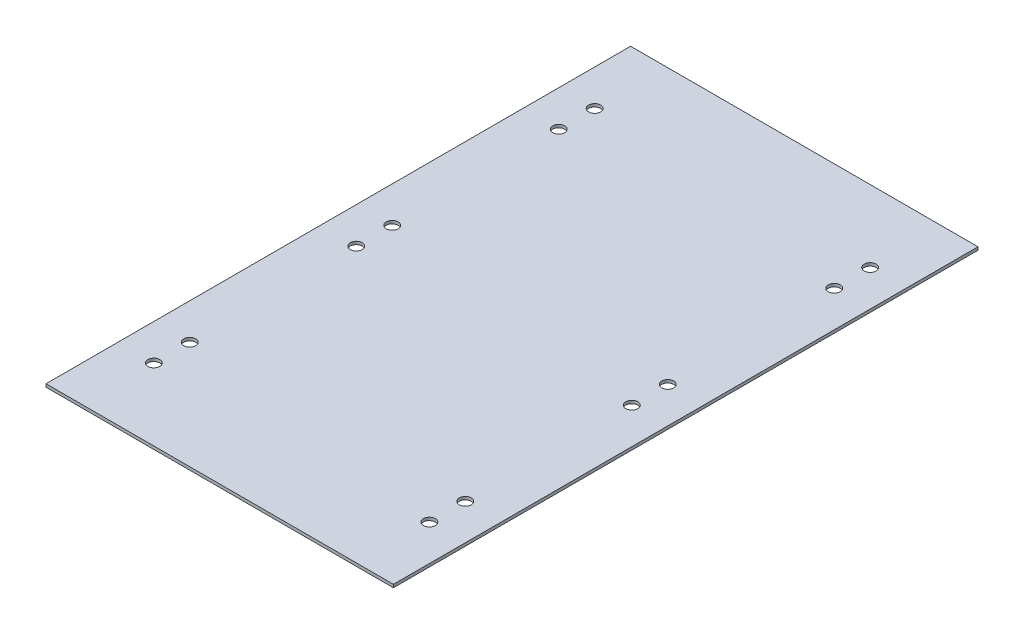
ISO-10303-21;
HEADER;
FILE_DESCRIPTION(('STEP AP214'),'2;1');
FILE_NAME('part.step','',(''),(''),'','','');
FILE_SCHEMA(('AUTOMOTIVE_DESIGN { 1 0 10303 214 1 1 1 1 }'));
ENDSEC;
DATA;
#1=APPLICATION_CONTEXT('core data for automotive mechanical design processes');
#2=APPLICATION_PROTOCOL_DEFINITION('international standard','automotive_design',2000,#1);
#3=PRODUCT_CONTEXT('',#1,'mechanical');
#4=PRODUCT('Part','Part','',(#3));
#5=PRODUCT_RELATED_PRODUCT_CATEGORY('part','',(#4));
#6=PRODUCT_DEFINITION_FORMATION('','',#4);
#7=PRODUCT_DEFINITION_CONTEXT('part definition',#1,'design');
#8=PRODUCT_DEFINITION('design','',#6,#7);
#9=PRODUCT_DEFINITION_SHAPE('','',#8);
#10=(LENGTH_UNIT() NAMED_UNIT(*) SI_UNIT(.MILLI.,.METRE.));
#11=(NAMED_UNIT(*) PLANE_ANGLE_UNIT() SI_UNIT($,.RADIAN.));
#12=(NAMED_UNIT(*) SI_UNIT($,.STERADIAN.) SOLID_ANGLE_UNIT());
#13=UNCERTAINTY_MEASURE_WITH_UNIT(LENGTH_MEASURE(1.E-05),#10,'distance_accuracy_value','');
#14=(GEOMETRIC_REPRESENTATION_CONTEXT(3) GLOBAL_UNCERTAINTY_ASSIGNED_CONTEXT((#13)) GLOBAL_UNIT_ASSIGNED_CONTEXT((#10,
#11,#12)) REPRESENTATION_CONTEXT('',''));
#15=CARTESIAN_POINT('',(0.,0.,0.));
#16=DIRECTION('',(0.,0.,1.));
#17=DIRECTION('',(1.,0.,0.));
#18=AXIS2_PLACEMENT_3D('',#15,#16,#17);
#19=CARTESIAN_POINT('',(-92.075,1.5875,154.94));
#20=DIRECTION('',(1.,0.,0.));
#21=DIRECTION('',(0.,0.,-1.));
#22=AXIS2_PLACEMENT_3D('',#19,#20,#21);
#23=PLANE('',#22);
#24=DIRECTION('',(0.,0.,1.));
#25=VECTOR('',#24,1.);
#26=CARTESIAN_POINT('',(-92.075,0.,154.94));
#27=LINE('',#26,#25);
#28=CARTESIAN_POINT('',(-92.075,0.,-154.94));
#29=VERTEX_POINT('',#28);
#30=CARTESIAN_POINT('',(-92.075,0.,154.94));
#31=VERTEX_POINT('',#30);
#32=EDGE_CURVE('E113',#29,#31,#27,.T.);
#33=ORIENTED_EDGE('',*,*,#32,.T.);
#34=DIRECTION('',(0.,-1.,0.));
#35=VECTOR('',#34,1.);
#36=CARTESIAN_POINT('',(-92.075,1.5875,154.94));
#37=LINE('',#36,#35);
#38=CARTESIAN_POINT('',(-92.075,1.5875,154.94));
#39=VERTEX_POINT('',#38);
#40=EDGE_CURVE('E11',#39,#31,#37,.T.);
#41=ORIENTED_EDGE('',*,*,#40,.F.);
#42=DIRECTION('',(0.,0.,1.));
#43=VECTOR('',#42,1.);
#44=CARTESIAN_POINT('',(-92.075,1.5875,154.94));
#45=LINE('',#44,#43);
#46=CARTESIAN_POINT('',(-92.075,1.5875,-154.94));
#47=VERTEX_POINT('',#46);
#48=EDGE_CURVE('E97',#47,#39,#45,.T.);
#49=ORIENTED_EDGE('',*,*,#48,.F.);
#50=DIRECTION('',(0.,-1.,0.));
#51=VECTOR('',#50,1.);
#52=CARTESIAN_POINT('',(-92.075,1.5875,-154.94));
#53=LINE('',#52,#51);
#54=EDGE_CURVE('E109',#47,#29,#53,.T.);
#55=ORIENTED_EDGE('',*,*,#54,.T.);
#56=EDGE_LOOP('',(#33,#41,#49,#55));
#57=FACE_BOUND('',#56,.T.);
#58=ADVANCED_FACE('F45',(#57),#23,.F.);
#59=CARTESIAN_POINT('',(-92.075,1.5875,154.94));
#60=DIRECTION('',(0.,0.,-1.));
#61=DIRECTION('',(-1.,0.,0.));
#62=AXIS2_PLACEMENT_3D('',#59,#60,#61);
#63=PLANE('',#62);
#64=DIRECTION('',(1.,0.,0.));
#65=VECTOR('',#64,1.);
#66=CARTESIAN_POINT('',(-92.075,0.,154.94));
#67=LINE('',#66,#65);
#68=CARTESIAN_POINT('',(92.075,0.,154.94));
#69=VERTEX_POINT('',#68);
#70=EDGE_CURVE('E102',#31,#69,#67,.T.);
#71=ORIENTED_EDGE('',*,*,#70,.T.);
#72=DIRECTION('',(0.,-1.,0.));
#73=VECTOR('',#72,1.);
#74=CARTESIAN_POINT('',(92.075,1.5875,154.94));
#75=LINE('',#74,#73);
#76=CARTESIAN_POINT('',(92.075,1.5875,154.94));
#77=VERTEX_POINT('',#76);
#78=EDGE_CURVE('E54',#77,#69,#75,.T.);
#79=ORIENTED_EDGE('',*,*,#78,.F.);
#80=DIRECTION('',(1.,0.,0.));
#81=VECTOR('',#80,1.);
#82=CARTESIAN_POINT('',(-92.075,1.5875,154.94));
#83=LINE('',#82,#81);
#84=EDGE_CURVE('E92',#39,#77,#83,.T.);
#85=ORIENTED_EDGE('',*,*,#84,.F.);
#86=ORIENTED_EDGE('',*,*,#40,.T.);
#87=EDGE_LOOP('',(#71,#79,#85,#86));
#88=FACE_BOUND('',#87,.T.);
#89=ADVANCED_FACE('F101',(#88),#63,.F.);
#90=CARTESIAN_POINT('',(92.075,1.5875,154.94));
#91=DIRECTION('',(-1.,0.,0.));
#92=DIRECTION('',(0.,0.,1.));
#93=AXIS2_PLACEMENT_3D('',#90,#91,#92);
#94=PLANE('',#93);
#95=DIRECTION('',(0.,0.,-1.));
#96=VECTOR('',#95,1.);
#97=CARTESIAN_POINT('',(92.075,0.,154.94));
#98=LINE('',#97,#96);
#99=CARTESIAN_POINT('',(92.075,0.,-154.94));
#100=VERTEX_POINT('',#99);
#101=EDGE_CURVE('E79',#69,#100,#98,.T.);
#102=ORIENTED_EDGE('',*,*,#101,.T.);
#103=DIRECTION('',(0.,-1.,0.));
#104=VECTOR('',#103,1.);
#105=CARTESIAN_POINT('',(92.075,1.5875,-154.94));
#106=LINE('',#105,#104);
#107=CARTESIAN_POINT('',(92.075,1.5875,-154.94));
#108=VERTEX_POINT('',#107);
#109=EDGE_CURVE('E104',#108,#100,#106,.T.);
#110=ORIENTED_EDGE('',*,*,#109,.F.);
#111=DIRECTION('',(0.,0.,-1.));
#112=VECTOR('',#111,1.);
#113=CARTESIAN_POINT('',(92.075,1.5875,154.94));
#114=LINE('',#113,#112);
#115=EDGE_CURVE('E95',#77,#108,#114,.T.);
#116=ORIENTED_EDGE('',*,*,#115,.F.);
#117=ORIENTED_EDGE('',*,*,#78,.T.);
#118=EDGE_LOOP('',(#102,#110,#116,#117));
#119=FACE_BOUND('',#118,.T.);
#120=ADVANCED_FACE('F105',(#119),#94,.F.);
#121=CARTESIAN_POINT('',(-92.075,1.5875,-154.94));
#122=DIRECTION('',(0.,0.,1.));
#123=DIRECTION('',(1.,0.,0.));
#124=AXIS2_PLACEMENT_3D('',#121,#122,#123);
#125=PLANE('',#124);
#126=DIRECTION('',(-1.,0.,0.));
#127=VECTOR('',#126,1.);
#128=CARTESIAN_POINT('',(-92.075,0.,-154.94));
#129=LINE('',#128,#127);
#130=EDGE_CURVE('E85',#100,#29,#129,.T.);
#131=ORIENTED_EDGE('',*,*,#130,.T.);
#132=ORIENTED_EDGE('',*,*,#54,.F.);
#133=DIRECTION('',(-1.,0.,0.));
#134=VECTOR('',#133,1.);
#135=CARTESIAN_POINT('',(-92.075,1.5875,-154.94));
#136=LINE('',#135,#134);
#137=EDGE_CURVE('E62',#108,#47,#136,.T.);
#138=ORIENTED_EDGE('',*,*,#137,.F.);
#139=ORIENTED_EDGE('',*,*,#109,.T.);
#140=EDGE_LOOP('',(#131,#132,#138,#139));
#141=FACE_BOUND('',#140,.T.);
#142=ADVANCED_FACE('F127',(#141),#125,.F.);
#143=CARTESIAN_POINT('',(0.,1.5875,0.));
#144=DIRECTION('',(0.,-1.,0.));
#145=DIRECTION('',(0.,0.,-1.));
#146=AXIS2_PLACEMENT_3D('',#143,#144,#145);
#147=PLANE('',#146);
#148=CARTESIAN_POINT('',(73.025,1.5875,116.84));
#149=DIRECTION('',(0.,-1.,0.));
#150=DIRECTION('',(0.,0.,1.));
#151=AXIS2_PLACEMENT_3D('',#148,#149,#150);
#152=CIRCLE('',#151,3.17500000000001);
#153=CARTESIAN_POINT('',(73.025,1.5875,120.015));
#154=VERTEX_POINT('',#153);
#155=EDGE_CURVE('E206',#154,#154,#152,.T.);
#156=ORIENTED_EDGE('',*,*,#155,.T.);
#157=EDGE_LOOP('',(#156));
#158=FACE_BOUND('',#157,.T.);
#159=CARTESIAN_POINT('',(73.025,1.5875,-97.79));
#160=DIRECTION('',(0.,-1.,0.));
#161=DIRECTION('',(0.,0.,1.));
#162=AXIS2_PLACEMENT_3D('',#159,#160,#161);
#163=CIRCLE('',#162,3.175);
#164=CARTESIAN_POINT('',(73.025,1.5875,-94.615));
#165=VERTEX_POINT('',#164);
#166=EDGE_CURVE('E215',#165,#165,#163,.T.);
#167=ORIENTED_EDGE('',*,*,#166,.T.);
#168=EDGE_LOOP('',(#167));
#169=FACE_BOUND('',#168,.T.);
#170=CARTESIAN_POINT('',(73.025,1.5875,-116.84));
#171=DIRECTION('',(0.,-1.,0.));
#172=DIRECTION('',(0.,0.,1.));
#173=AXIS2_PLACEMENT_3D('',#170,#171,#172);
#174=CIRCLE('',#173,3.175);
#175=CARTESIAN_POINT('',(73.025,1.5875,-113.665));
#176=VERTEX_POINT('',#175);
#177=EDGE_CURVE('E190',#176,#176,#174,.T.);
#178=ORIENTED_EDGE('',*,*,#177,.T.);
#179=EDGE_LOOP('',(#178));
#180=FACE_BOUND('',#179,.T.);
#181=CARTESIAN_POINT('',(73.025,1.5875,9.525));
#182=DIRECTION('',(0.,-1.,0.));
#183=DIRECTION('',(0.,0.,1.));
#184=AXIS2_PLACEMENT_3D('',#181,#182,#183);
#185=CIRCLE('',#184,3.175);
#186=CARTESIAN_POINT('',(73.025,1.5875,12.7));
#187=VERTEX_POINT('',#186);
#188=EDGE_CURVE('E199',#187,#187,#185,.T.);
#189=ORIENTED_EDGE('',*,*,#188,.T.);
#190=EDGE_LOOP('',(#189));
#191=FACE_BOUND('',#190,.T.);
#192=CARTESIAN_POINT('',(73.025,1.5875,97.79));
#193=DIRECTION('',(0.,-1.,0.));
#194=DIRECTION('',(0.,0.,1.));
#195=AXIS2_PLACEMENT_3D('',#192,#193,#194);
#196=CIRCLE('',#195,3.175);
#197=CARTESIAN_POINT('',(73.025,1.5875,100.965));
#198=VERTEX_POINT('',#197);
#199=EDGE_CURVE('E222',#198,#198,#196,.T.);
#200=ORIENTED_EDGE('',*,*,#199,.T.);
#201=EDGE_LOOP('',(#200));
#202=FACE_BOUND('',#201,.T.);
#203=CARTESIAN_POINT('',(73.025,1.5875,-9.525));
#204=DIRECTION('',(0.,-1.,0.));
#205=DIRECTION('',(0.,0.,1.));
#206=AXIS2_PLACEMENT_3D('',#203,#204,#205);
#207=CIRCLE('',#206,3.175);
#208=CARTESIAN_POINT('',(73.025,1.5875,-6.35));
#209=VERTEX_POINT('',#208);
#210=EDGE_CURVE('E182',#209,#209,#207,.T.);
#211=ORIENTED_EDGE('',*,*,#210,.T.);
#212=EDGE_LOOP('',(#211));
#213=FACE_BOUND('',#212,.T.);
#214=CARTESIAN_POINT('',(-73.025,1.5875,116.84));
#215=DIRECTION('',(0.,1.,0.));
#216=DIRECTION('',(0.,0.,1.));
#217=AXIS2_PLACEMENT_3D('',#214,#215,#216);
#218=CIRCLE('',#217,3.17500000000001);
#219=CARTESIAN_POINT('',(-73.025,1.5875,120.015));
#220=VERTEX_POINT('',#219);
#221=EDGE_CURVE('E158',#220,#220,#218,.T.);
#222=ORIENTED_EDGE('',*,*,#221,.F.);
#223=EDGE_LOOP('',(#222));
#224=FACE_BOUND('',#223,.T.);
#225=CARTESIAN_POINT('',(-73.025,1.5875,-97.79));
#226=DIRECTION('',(0.,1.,0.));
#227=DIRECTION('',(0.,0.,1.));
#228=AXIS2_PLACEMENT_3D('',#225,#226,#227);
#229=CIRCLE('',#228,3.175);
#230=CARTESIAN_POINT('',(-73.025,1.5875,-94.615));
#231=VERTEX_POINT('',#230);
#232=EDGE_CURVE('E167',#231,#231,#229,.T.);
#233=ORIENTED_EDGE('',*,*,#232,.F.);
#234=EDGE_LOOP('',(#233));
#235=FACE_BOUND('',#234,.T.);
#236=CARTESIAN_POINT('',(-73.025,1.5875,-116.84));
#237=DIRECTION('',(0.,1.,0.));
#238=DIRECTION('',(0.,0.,1.));
#239=AXIS2_PLACEMENT_3D('',#236,#237,#238);
#240=CIRCLE('',#239,3.175);
#241=CARTESIAN_POINT('',(-73.025,1.5875,-113.665));
#242=VERTEX_POINT('',#241);
#243=EDGE_CURVE('E142',#242,#242,#240,.T.);
#244=ORIENTED_EDGE('',*,*,#243,.F.);
#245=EDGE_LOOP('',(#244));
#246=FACE_BOUND('',#245,.T.);
#247=CARTESIAN_POINT('',(-73.025,1.5875,9.525));
#248=DIRECTION('',(0.,1.,0.));
#249=DIRECTION('',(0.,0.,1.));
#250=AXIS2_PLACEMENT_3D('',#247,#248,#249);
#251=CIRCLE('',#250,3.175);
#252=CARTESIAN_POINT('',(-73.025,1.5875,12.7));
#253=VERTEX_POINT('',#252);
#254=EDGE_CURVE('E151',#253,#253,#251,.T.);
#255=ORIENTED_EDGE('',*,*,#254,.F.);
#256=EDGE_LOOP('',(#255));
#257=FACE_BOUND('',#256,.T.);
#258=CARTESIAN_POINT('',(-73.025,1.5875,97.79));
#259=DIRECTION('',(0.,1.,0.));
#260=DIRECTION('',(0.,0.,1.));
#261=AXIS2_PLACEMENT_3D('',#258,#259,#260);
#262=CIRCLE('',#261,3.175);
#263=CARTESIAN_POINT('',(-73.025,1.5875,100.965));
#264=VERTEX_POINT('',#263);
#265=EDGE_CURVE('E174',#264,#264,#262,.T.);
#266=ORIENTED_EDGE('',*,*,#265,.F.);
#267=EDGE_LOOP('',(#266));
#268=FACE_BOUND('',#267,.T.);
#269=CARTESIAN_POINT('',(-73.025,1.5875,-9.525));
#270=DIRECTION('',(0.,1.,0.));
#271=DIRECTION('',(0.,0.,1.));
#272=AXIS2_PLACEMENT_3D('',#269,#270,#271);
#273=CIRCLE('',#272,3.175);
#274=CARTESIAN_POINT('',(-73.025,1.5875,-6.35));
#275=VERTEX_POINT('',#274);
#276=EDGE_CURVE('E134',#275,#275,#273,.T.);
#277=ORIENTED_EDGE('',*,*,#276,.F.);
#278=EDGE_LOOP('',(#277));
#279=FACE_BOUND('',#278,.T.);
#280=ORIENTED_EDGE('',*,*,#48,.T.);
#281=ORIENTED_EDGE('',*,*,#84,.T.);
#282=ORIENTED_EDGE('',*,*,#115,.T.);
#283=ORIENTED_EDGE('',*,*,#137,.T.);
#284=EDGE_LOOP('',(#280,#281,#282,#283));
#285=FACE_BOUND('',#284,.T.);
#286=ADVANCED_FACE('F93',(#158,#169,#180,#191,#202,#213,#224,#235,#246,#257,#268,#279,#285),
#147,.F.);
#287=CARTESIAN_POINT('',(0.,0.,0.));
#288=DIRECTION('',(0.,-1.,0.));
#289=DIRECTION('',(0.,0.,-1.));
#290=AXIS2_PLACEMENT_3D('',#287,#288,#289);
#291=PLANE('',#290);
#292=CARTESIAN_POINT('',(73.025,0.,116.84));
#293=DIRECTION('',(0.,-1.,0.));
#294=DIRECTION('',(0.,0.,1.));
#295=AXIS2_PLACEMENT_3D('',#292,#293,#294);
#296=CIRCLE('',#295,3.17500000000001);
#297=CARTESIAN_POINT('',(73.025,0.,120.015));
#298=VERTEX_POINT('',#297);
#299=EDGE_CURVE('E210',#298,#298,#296,.T.);
#300=ORIENTED_EDGE('',*,*,#299,.F.);
#301=EDGE_LOOP('',(#300));
#302=FACE_BOUND('',#301,.T.);
#303=CARTESIAN_POINT('',(73.025,0.,-97.79));
#304=DIRECTION('',(0.,-1.,0.));
#305=DIRECTION('',(0.,0.,1.));
#306=AXIS2_PLACEMENT_3D('',#303,#304,#305);
#307=CIRCLE('',#306,3.175);
#308=CARTESIAN_POINT('',(73.025,0.,-94.615));
#309=VERTEX_POINT('',#308);
#310=EDGE_CURVE('E195',#309,#309,#307,.T.);
#311=ORIENTED_EDGE('',*,*,#310,.F.);
#312=EDGE_LOOP('',(#311));
#313=FACE_BOUND('',#312,.T.);
#314=CARTESIAN_POINT('',(73.025,0.,-116.84));
#315=DIRECTION('',(0.,-1.,0.));
#316=DIRECTION('',(0.,0.,1.));
#317=AXIS2_PLACEMENT_3D('',#314,#315,#316);
#318=CIRCLE('',#317,3.175);
#319=CARTESIAN_POINT('',(73.025,0.,-113.665));
#320=VERTEX_POINT('',#319);
#321=EDGE_CURVE('E194',#320,#320,#318,.T.);
#322=ORIENTED_EDGE('',*,*,#321,.F.);
#323=EDGE_LOOP('',(#322));
#324=FACE_BOUND('',#323,.T.);
#325=CARTESIAN_POINT('',(73.025,0.,9.525));
#326=DIRECTION('',(0.,-1.,0.));
#327=DIRECTION('',(0.,0.,1.));
#328=AXIS2_PLACEMENT_3D('',#325,#326,#327);
#329=CIRCLE('',#328,3.175);
#330=CARTESIAN_POINT('',(73.025,0.,12.7));
#331=VERTEX_POINT('',#330);
#332=EDGE_CURVE('E186',#331,#331,#329,.T.);
#333=ORIENTED_EDGE('',*,*,#332,.F.);
#334=EDGE_LOOP('',(#333));
#335=FACE_BOUND('',#334,.T.);
#336=CARTESIAN_POINT('',(73.025,0.,97.79));
#337=DIRECTION('',(0.,-1.,0.));
#338=DIRECTION('',(0.,0.,1.));
#339=AXIS2_PLACEMENT_3D('',#336,#337,#338);
#340=CIRCLE('',#339,3.175);
#341=CARTESIAN_POINT('',(73.025,0.,100.965));
#342=VERTEX_POINT('',#341);
#343=EDGE_CURVE('E211',#342,#342,#340,.T.);
#344=ORIENTED_EDGE('',*,*,#343,.F.);
#345=EDGE_LOOP('',(#344));
#346=FACE_BOUND('',#345,.T.);
#347=CARTESIAN_POINT('',(73.025,0.,-9.525));
#348=DIRECTION('',(0.,-1.,0.));
#349=DIRECTION('',(0.,0.,1.));
#350=AXIS2_PLACEMENT_3D('',#347,#348,#349);
#351=CIRCLE('',#350,3.175);
#352=CARTESIAN_POINT('',(73.025,0.,-6.35));
#353=VERTEX_POINT('',#352);
#354=EDGE_CURVE('E178',#353,#353,#351,.T.);
#355=ORIENTED_EDGE('',*,*,#354,.F.);
#356=EDGE_LOOP('',(#355));
#357=FACE_BOUND('',#356,.T.);
#358=CARTESIAN_POINT('',(-73.025,0.,116.84));
#359=DIRECTION('',(0.,1.,0.));
#360=DIRECTION('',(0.,0.,1.));
#361=AXIS2_PLACEMENT_3D('',#358,#359,#360);
#362=CIRCLE('',#361,3.17500000000001);
#363=CARTESIAN_POINT('',(-73.025,0.,120.015));
#364=VERTEX_POINT('',#363);
#365=EDGE_CURVE('E162',#364,#364,#362,.T.);
#366=ORIENTED_EDGE('',*,*,#365,.T.);
#367=EDGE_LOOP('',(#366));
#368=FACE_BOUND('',#367,.T.);
#369=CARTESIAN_POINT('',(-73.025,0.,-97.79));
#370=DIRECTION('',(0.,1.,0.));
#371=DIRECTION('',(0.,0.,1.));
#372=AXIS2_PLACEMENT_3D('',#369,#370,#371);
#373=CIRCLE('',#372,3.175);
#374=CARTESIAN_POINT('',(-73.025,0.,-94.615));
#375=VERTEX_POINT('',#374);
#376=EDGE_CURVE('E147',#375,#375,#373,.T.);
#377=ORIENTED_EDGE('',*,*,#376,.T.);
#378=EDGE_LOOP('',(#377));
#379=FACE_BOUND('',#378,.T.);
#380=CARTESIAN_POINT('',(-73.025,0.,-116.84));
#381=DIRECTION('',(0.,1.,0.));
#382=DIRECTION('',(0.,0.,1.));
#383=AXIS2_PLACEMENT_3D('',#380,#381,#382);
#384=CIRCLE('',#383,3.175);
#385=CARTESIAN_POINT('',(-73.025,0.,-113.665));
#386=VERTEX_POINT('',#385);
#387=EDGE_CURVE('E146',#386,#386,#384,.T.);
#388=ORIENTED_EDGE('',*,*,#387,.T.);
#389=EDGE_LOOP('',(#388));
#390=FACE_BOUND('',#389,.T.);
#391=CARTESIAN_POINT('',(-73.025,0.,9.525));
#392=DIRECTION('',(0.,1.,0.));
#393=DIRECTION('',(0.,0.,1.));
#394=AXIS2_PLACEMENT_3D('',#391,#392,#393);
#395=CIRCLE('',#394,3.175);
#396=CARTESIAN_POINT('',(-73.025,0.,12.7));
#397=VERTEX_POINT('',#396);
#398=EDGE_CURVE('E138',#397,#397,#395,.T.);
#399=ORIENTED_EDGE('',*,*,#398,.T.);
#400=EDGE_LOOP('',(#399));
#401=FACE_BOUND('',#400,.T.);
#402=CARTESIAN_POINT('',(-73.025,0.,97.79));
#403=DIRECTION('',(0.,1.,0.));
#404=DIRECTION('',(0.,0.,1.));
#405=AXIS2_PLACEMENT_3D('',#402,#403,#404);
#406=CIRCLE('',#405,3.175);
#407=CARTESIAN_POINT('',(-73.025,0.,100.965));
#408=VERTEX_POINT('',#407);
#409=EDGE_CURVE('E163',#408,#408,#406,.T.);
#410=ORIENTED_EDGE('',*,*,#409,.T.);
#411=EDGE_LOOP('',(#410));
#412=FACE_BOUND('',#411,.T.);
#413=CARTESIAN_POINT('',(-73.025,0.,-9.525));
#414=DIRECTION('',(0.,1.,0.));
#415=DIRECTION('',(0.,0.,1.));
#416=AXIS2_PLACEMENT_3D('',#413,#414,#415);
#417=CIRCLE('',#416,3.175);
#418=CARTESIAN_POINT('',(-73.025,0.,-6.35));
#419=VERTEX_POINT('',#418);
#420=EDGE_CURVE('E117',#419,#419,#417,.T.);
#421=ORIENTED_EDGE('',*,*,#420,.T.);
#422=EDGE_LOOP('',(#421));
#423=FACE_BOUND('',#422,.T.);
#424=ORIENTED_EDGE('',*,*,#32,.F.);
#425=ORIENTED_EDGE('',*,*,#130,.F.);
#426=ORIENTED_EDGE('',*,*,#101,.F.);
#427=ORIENTED_EDGE('',*,*,#70,.F.);
#428=EDGE_LOOP('',(#424,#425,#426,#427));
#429=FACE_BOUND('',#428,.T.);
#430=ADVANCED_FACE('F130',(#302,#313,#324,#335,#346,#357,#368,#379,#390,#401,#412,#423,#429),
#291,.T.);
#431=CARTESIAN_POINT('',(-73.025,0.,-9.525));
#432=DIRECTION('',(0.,1.,0.));
#433=DIRECTION('',(0.,0.,1.));
#434=AXIS2_PLACEMENT_3D('',#431,#432,#433);
#435=CYLINDRICAL_SURFACE('',#434,3.175);
#436=ORIENTED_EDGE('',*,*,#420,.F.);
#437=EDGE_LOOP('',(#436));
#438=FACE_BOUND('',#437,.T.);
#439=ORIENTED_EDGE('',*,*,#276,.T.);
#440=EDGE_LOOP('',(#439));
#441=FACE_BOUND('',#440,.T.);
#442=ADVANCED_FACE('F235',(#438,#441),#435,.F.);
#443=CARTESIAN_POINT('',(-73.025,0.,97.79));
#444=DIRECTION('',(0.,1.,0.));
#445=DIRECTION('',(0.,0.,1.));
#446=AXIS2_PLACEMENT_3D('',#443,#444,#445);
#447=CYLINDRICAL_SURFACE('',#446,3.175);
#448=ORIENTED_EDGE('',*,*,#409,.F.);
#449=EDGE_LOOP('',(#448));
#450=FACE_BOUND('',#449,.T.);
#451=ORIENTED_EDGE('',*,*,#265,.T.);
#452=EDGE_LOOP('',(#451));
#453=FACE_BOUND('',#452,.T.);
#454=ADVANCED_FACE('F254',(#450,#453),#447,.F.);
#455=CARTESIAN_POINT('',(-73.025,0.,9.525));
#456=DIRECTION('',(0.,1.,0.));
#457=DIRECTION('',(0.,0.,1.));
#458=AXIS2_PLACEMENT_3D('',#455,#456,#457);
#459=CYLINDRICAL_SURFACE('',#458,3.175);
#460=ORIENTED_EDGE('',*,*,#398,.F.);
#461=EDGE_LOOP('',(#460));
#462=FACE_BOUND('',#461,.T.);
#463=ORIENTED_EDGE('',*,*,#254,.T.);
#464=EDGE_LOOP('',(#463));
#465=FACE_BOUND('',#464,.T.);
#466=ADVANCED_FACE('F297',(#462,#465),#459,.F.);
#467=CARTESIAN_POINT('',(-73.025,0.,-116.84));
#468=DIRECTION('',(0.,1.,0.));
#469=DIRECTION('',(0.,0.,1.));
#470=AXIS2_PLACEMENT_3D('',#467,#468,#469);
#471=CYLINDRICAL_SURFACE('',#470,3.175);
#472=ORIENTED_EDGE('',*,*,#387,.F.);
#473=EDGE_LOOP('',(#472));
#474=FACE_BOUND('',#473,.T.);
#475=ORIENTED_EDGE('',*,*,#243,.T.);
#476=EDGE_LOOP('',(#475));
#477=FACE_BOUND('',#476,.T.);
#478=ADVANCED_FACE('F307',(#474,#477),#471,.F.);
#479=CARTESIAN_POINT('',(-73.025,0.,-97.79));
#480=DIRECTION('',(0.,1.,0.));
#481=DIRECTION('',(0.,0.,1.));
#482=AXIS2_PLACEMENT_3D('',#479,#480,#481);
#483=CYLINDRICAL_SURFACE('',#482,3.175);
#484=ORIENTED_EDGE('',*,*,#376,.F.);
#485=EDGE_LOOP('',(#484));
#486=FACE_BOUND('',#485,.T.);
#487=ORIENTED_EDGE('',*,*,#232,.T.);
#488=EDGE_LOOP('',(#487));
#489=FACE_BOUND('',#488,.T.);
#490=ADVANCED_FACE('F317',(#486,#489),#483,.F.);
#491=CARTESIAN_POINT('',(-73.025,0.,116.84));
#492=DIRECTION('',(0.,1.,0.));
#493=DIRECTION('',(0.,0.,1.));
#494=AXIS2_PLACEMENT_3D('',#491,#492,#493);
#495=CYLINDRICAL_SURFACE('',#494,3.17500000000001);
#496=ORIENTED_EDGE('',*,*,#365,.F.);
#497=EDGE_LOOP('',(#496));
#498=FACE_BOUND('',#497,.T.);
#499=ORIENTED_EDGE('',*,*,#221,.T.);
#500=EDGE_LOOP('',(#499));
#501=FACE_BOUND('',#500,.T.);
#502=ADVANCED_FACE('F327',(#498,#501),#495,.F.);
#503=CARTESIAN_POINT('',(73.025,0.,-9.525));
#504=DIRECTION('',(0.,1.,0.));
#505=DIRECTION('',(0.,0.,1.));
#506=AXIS2_PLACEMENT_3D('',#503,#504,#505);
#507=CYLINDRICAL_SURFACE('',#506,3.175);
#508=ORIENTED_EDGE('',*,*,#354,.T.);
#509=EDGE_LOOP('',(#508));
#510=FACE_BOUND('',#509,.T.);
#511=ORIENTED_EDGE('',*,*,#210,.F.);
#512=EDGE_LOOP('',(#511));
#513=FACE_BOUND('',#512,.T.);
#514=ADVANCED_FACE('F336',(#510,#513),#507,.F.);
#515=CARTESIAN_POINT('',(73.025,0.,97.79));
#516=DIRECTION('',(0.,1.,0.));
#517=DIRECTION('',(0.,0.,1.));
#518=AXIS2_PLACEMENT_3D('',#515,#516,#517);
#519=CYLINDRICAL_SURFACE('',#518,3.175);
#520=ORIENTED_EDGE('',*,*,#343,.T.);
#521=EDGE_LOOP('',(#520));
#522=FACE_BOUND('',#521,.T.);
#523=ORIENTED_EDGE('',*,*,#199,.F.);
#524=EDGE_LOOP('',(#523));
#525=FACE_BOUND('',#524,.T.);
#526=ADVANCED_FACE('F230',(#522,#525),#519,.F.);
#527=CARTESIAN_POINT('',(73.025,0.,9.525));
#528=DIRECTION('',(0.,1.,0.));
#529=DIRECTION('',(0.,0.,1.));
#530=AXIS2_PLACEMENT_3D('',#527,#528,#529);
#531=CYLINDRICAL_SURFACE('',#530,3.175);
#532=ORIENTED_EDGE('',*,*,#332,.T.);
#533=EDGE_LOOP('',(#532));
#534=FACE_BOUND('',#533,.T.);
#535=ORIENTED_EDGE('',*,*,#188,.F.);
#536=EDGE_LOOP('',(#535));
#537=FACE_BOUND('',#536,.T.);
#538=ADVANCED_FACE('F364',(#534,#537),#531,.F.);
#539=CARTESIAN_POINT('',(73.025,0.,-116.84));
#540=DIRECTION('',(0.,1.,0.));
#541=DIRECTION('',(0.,0.,1.));
#542=AXIS2_PLACEMENT_3D('',#539,#540,#541);
#543=CYLINDRICAL_SURFACE('',#542,3.175);
#544=ORIENTED_EDGE('',*,*,#321,.T.);
#545=EDGE_LOOP('',(#544));
#546=FACE_BOUND('',#545,.T.);
#547=ORIENTED_EDGE('',*,*,#177,.F.);
#548=EDGE_LOOP('',(#547));
#549=FACE_BOUND('',#548,.T.);
#550=ADVANCED_FACE('F373',(#546,#549),#543,.F.);
#551=CARTESIAN_POINT('',(73.025,0.,-97.79));
#552=DIRECTION('',(0.,1.,0.));
#553=DIRECTION('',(0.,0.,1.));
#554=AXIS2_PLACEMENT_3D('',#551,#552,#553);
#555=CYLINDRICAL_SURFACE('',#554,3.175);
#556=ORIENTED_EDGE('',*,*,#310,.T.);
#557=EDGE_LOOP('',(#556));
#558=FACE_BOUND('',#557,.T.);
#559=ORIENTED_EDGE('',*,*,#166,.F.);
#560=EDGE_LOOP('',(#559));
#561=FACE_BOUND('',#560,.T.);
#562=ADVANCED_FACE('F383',(#558,#561),#555,.F.);
#563=CARTESIAN_POINT('',(73.025,0.,116.84));
#564=DIRECTION('',(0.,1.,0.));
#565=DIRECTION('',(0.,0.,1.));
#566=AXIS2_PLACEMENT_3D('',#563,#564,#565);
#567=CYLINDRICAL_SURFACE('',#566,3.17500000000001);
#568=ORIENTED_EDGE('',*,*,#299,.T.);
#569=EDGE_LOOP('',(#568));
#570=FACE_BOUND('',#569,.T.);
#571=ORIENTED_EDGE('',*,*,#155,.F.);
#572=EDGE_LOOP('',(#571));
#573=FACE_BOUND('',#572,.T.);
#574=ADVANCED_FACE('F393',(#570,#573),#567,.F.);
#575=CLOSED_SHELL('',(#58,#89,#120,#142,#286,#430,#442,#454,#466,#478,#490,#502,#514,#526,#538,
#550,#562,#574));
#576=MANIFOLD_SOLID_BREP('B2',#575);
#577=ADVANCED_BREP_SHAPE_REPRESENTATION('',(#18,#576),#14);
#578=SHAPE_DEFINITION_REPRESENTATION(#9,#577);
ENDSEC;
END-ISO-10303-21;
